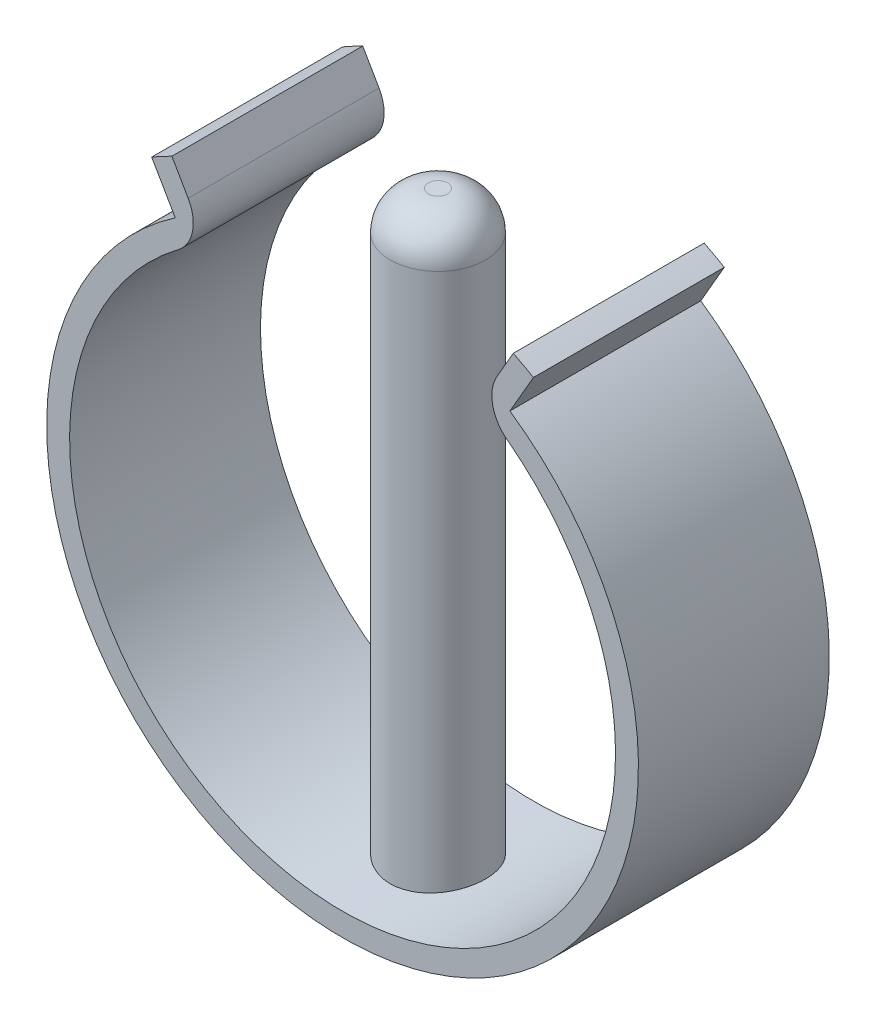
ISO-10303-21;
HEADER;
FILE_DESCRIPTION(('STEP AP214'),'2;1');
FILE_NAME('part.step','',(''),(''),'','','');
FILE_SCHEMA(('AUTOMOTIVE_DESIGN { 1 0 10303 214 1 1 1 1 }'));
ENDSEC;
DATA;
#1=APPLICATION_CONTEXT('core data for automotive mechanical design processes');
#2=APPLICATION_PROTOCOL_DEFINITION('international standard','automotive_design',2000,#1);
#3=PRODUCT_CONTEXT('',#1,'mechanical');
#4=PRODUCT('Part','Part','',(#3));
#5=PRODUCT_RELATED_PRODUCT_CATEGORY('part','',(#4));
#6=PRODUCT_DEFINITION_FORMATION('','',#4);
#7=PRODUCT_DEFINITION_CONTEXT('part definition',#1,'design');
#8=PRODUCT_DEFINITION('design','',#6,#7);
#9=PRODUCT_DEFINITION_SHAPE('','',#8);
#10=(LENGTH_UNIT() NAMED_UNIT(*) SI_UNIT(.MILLI.,.METRE.));
#11=(NAMED_UNIT(*) PLANE_ANGLE_UNIT() SI_UNIT($,.RADIAN.));
#12=(NAMED_UNIT(*) SI_UNIT($,.STERADIAN.) SOLID_ANGLE_UNIT());
#13=UNCERTAINTY_MEASURE_WITH_UNIT(LENGTH_MEASURE(1.E-05),#10,'distance_accuracy_value','');
#14=(GEOMETRIC_REPRESENTATION_CONTEXT(3) GLOBAL_UNCERTAINTY_ASSIGNED_CONTEXT((#13)) GLOBAL_UNIT_ASSIGNED_CONTEXT((#10,
#11,#12)) REPRESENTATION_CONTEXT('',''));
#15=CARTESIAN_POINT('',(0.,0.,0.));
#16=DIRECTION('',(0.,0.,1.));
#17=DIRECTION('',(1.,0.,0.));
#18=AXIS2_PLACEMENT_3D('',#15,#16,#17);
#19=CARTESIAN_POINT('',(0.,0.,-5.));
#20=DIRECTION('',(0.,0.,1.));
#21=DIRECTION('',(1.,0.,0.));
#22=AXIS2_PLACEMENT_3D('',#19,#20,#21);
#23=CYLINDRICAL_SURFACE('',#22,15.5);
#24=DIRECTION('',(0.,0.,1.));
#25=VECTOR('',#24,1.);
#26=CARTESIAN_POINT('',(8.76596977094151,12.7831050208836,-5.));
#27=LINE('',#26,#25);
#28=CARTESIAN_POINT('',(8.76596977094151,12.7831050208836,-5.));
#29=VERTEX_POINT('',#28);
#30=CARTESIAN_POINT('',(8.76596977094151,12.7831050208836,5.));
#31=VERTEX_POINT('',#30);
#32=EDGE_CURVE('E125',#29,#31,#27,.T.);
#33=ORIENTED_EDGE('',*,*,#32,.T.);
#34=CARTESIAN_POINT('',(0.,0.,5.));
#35=DIRECTION('',(0.,0.,1.));
#36=DIRECTION('',(1.,0.,0.));
#37=AXIS2_PLACEMENT_3D('',#34,#35,#36);
#38=CIRCLE('',#37,15.5);
#39=CARTESIAN_POINT('',(-8.76596977094151,12.7831050208836,5.));
#40=VERTEX_POINT('',#39);
#41=EDGE_CURVE('E123',#40,#31,#38,.T.);
#42=ORIENTED_EDGE('',*,*,#41,.F.);
#43=DIRECTION('',(0.,0.,1.));
#44=VECTOR('',#43,1.);
#45=CARTESIAN_POINT('',(-8.76596977094151,12.7831050208836,-5.));
#46=LINE('',#45,#44);
#47=CARTESIAN_POINT('',(-8.76596977094151,12.7831050208836,-5.));
#48=VERTEX_POINT('',#47);
#49=EDGE_CURVE('E176',#48,#40,#46,.T.);
#50=ORIENTED_EDGE('',*,*,#49,.F.);
#51=CARTESIAN_POINT('',(0.,0.,-5.));
#52=DIRECTION('',(0.,0.,1.));
#53=DIRECTION('',(1.,0.,0.));
#54=AXIS2_PLACEMENT_3D('',#51,#52,#53);
#55=CIRCLE('',#54,15.5);
#56=EDGE_CURVE('E130',#48,#29,#55,.T.);
#57=ORIENTED_EDGE('',*,*,#56,.T.);
#58=EDGE_LOOP('',(#33,#42,#50,#57));
#59=FACE_BOUND('',#58,.T.);
#60=ADVANCED_FACE('F44',(#59),#23,.T.);
#61=CARTESIAN_POINT('',(-8.76596977094151,12.7831050208836,-5.));
#62=DIRECTION('',(-0.866025403784439,-0.5,0.));
#63=DIRECTION('',(0.5,-0.866025403784439,0.));
#64=AXIS2_PLACEMENT_3D('',#61,#62,#63);
#65=PLANE('',#64);
#66=ORIENTED_EDGE('',*,*,#49,.T.);
#67=DIRECTION('',(0.5,-0.866025403784439,0.));
#68=VECTOR('',#67,1.);
#69=CARTESIAN_POINT('',(-8.76596977094151,12.7831050208836,5.));
#70=LINE('',#69,#68);
#71=CARTESIAN_POINT('',(-10.,14.9205080756888,5.));
#72=VERTEX_POINT('',#71);
#73=EDGE_CURVE('E150',#72,#40,#70,.T.);
#74=ORIENTED_EDGE('',*,*,#73,.F.);
#75=DIRECTION('',(0.,0.,1.));
#76=VECTOR('',#75,1.);
#77=CARTESIAN_POINT('',(-10.,14.9205080756888,-5.));
#78=LINE('',#77,#76);
#79=CARTESIAN_POINT('',(-10.,14.9205080756888,-5.));
#80=VERTEX_POINT('',#79);
#81=EDGE_CURVE('E185',#80,#72,#78,.T.);
#82=ORIENTED_EDGE('',*,*,#81,.F.);
#83=DIRECTION('',(0.5,-0.866025403784439,0.));
#84=VECTOR('',#83,1.);
#85=CARTESIAN_POINT('',(-8.76596977094151,12.7831050208836,-5.));
#86=LINE('',#85,#84);
#87=EDGE_CURVE('E131',#80,#48,#86,.T.);
#88=ORIENTED_EDGE('',*,*,#87,.T.);
#89=EDGE_LOOP('',(#66,#74,#82,#88));
#90=FACE_BOUND('',#89,.T.);
#91=ADVANCED_FACE('F214',(#90),#65,.T.);
#92=CARTESIAN_POINT('',(0.,-2.4,-5.));
#93=DIRECTION('',(0.,0.,1.));
#94=DIRECTION('',(1.,0.,0.));
#95=AXIS2_PLACEMENT_3D('',#92,#93,#94);
#96=CYLINDRICAL_SURFACE('',#95,20.);
#97=ORIENTED_EDGE('',*,*,#81,.T.);
#98=CARTESIAN_POINT('',(0.,-2.4,5.));
#99=DIRECTION('',(0.,0.,1.));
#100=DIRECTION('',(1.,0.,0.));
#101=AXIS2_PLACEMENT_3D('',#98,#99,#100);
#102=CIRCLE('',#101,20.);
#103=CARTESIAN_POINT('',(-8.94275328623292,15.4893030513089,5.));
#104=VERTEX_POINT('',#103);
#105=EDGE_CURVE('E158',#104,#72,#102,.T.);
#106=ORIENTED_EDGE('',*,*,#105,.F.);
#107=DIRECTION('',(0.,0.,1.));
#108=VECTOR('',#107,1.);
#109=CARTESIAN_POINT('',(-8.94275328623292,15.4893030513089,-5.));
#110=LINE('',#109,#108);
#111=CARTESIAN_POINT('',(-8.94275328623292,15.4893030513089,-5.));
#112=VERTEX_POINT('',#111);
#113=EDGE_CURVE('E184',#112,#104,#110,.T.);
#114=ORIENTED_EDGE('',*,*,#113,.F.);
#115=CARTESIAN_POINT('',(0.,-2.4,-5.));
#116=DIRECTION('',(0.,0.,1.));
#117=DIRECTION('',(1.,0.,0.));
#118=AXIS2_PLACEMENT_3D('',#115,#116,#117);
#119=CIRCLE('',#118,20.);
#120=EDGE_CURVE('E173',#112,#80,#119,.T.);
#121=ORIENTED_EDGE('',*,*,#120,.T.);
#122=EDGE_LOOP('',(#97,#106,#114,#121));
#123=FACE_BOUND('',#122,.T.);
#124=ADVANCED_FACE('F217',(#123),#96,.T.);
#125=CARTESIAN_POINT('',(-7.15000000000002,12.3841632741175,-5.));
#126=DIRECTION('',(0.866025403784438,0.500000000000001,0.));
#127=DIRECTION('',(-0.500000000000001,0.866025403784438,0.));
#128=AXIS2_PLACEMENT_3D('',#125,#126,#127);
#129=PLANE('',#128);
#130=DIRECTION('',(-0.500000000000001,0.866025403784438,0.));
#131=VECTOR('',#130,1.);
#132=CARTESIAN_POINT('',(-7.15000000000002,12.3841632741175,5.));
#133=LINE('',#132,#131);
#134=CARTESIAN_POINT('',(-8.08841764500328,14.0095503139822,5.));
#135=VERTEX_POINT('',#134);
#136=EDGE_CURVE('E156',#135,#104,#133,.T.);
#137=ORIENTED_EDGE('',*,*,#136,.F.);
#138=DIRECTION('',(0.,0.,1.));
#139=VECTOR('',#138,1.);
#140=CARTESIAN_POINT('',(-8.08841764500328,14.0095503139822,-5.));
#141=LINE('',#140,#139);
#142=CARTESIAN_POINT('',(-8.08841764500328,14.0095503139822,-5.));
#143=VERTEX_POINT('',#142);
#144=EDGE_CURVE('E11',#135,#143,#141,.F.);
#145=ORIENTED_EDGE('',*,*,#144,.T.);
#146=DIRECTION('',(-0.500000000000001,0.866025403784438,0.));
#147=VECTOR('',#146,1.);
#148=CARTESIAN_POINT('',(-7.15000000000002,12.3841632741175,-5.));
#149=LINE('',#148,#147);
#150=EDGE_CURVE('E171',#143,#112,#149,.T.);
#151=ORIENTED_EDGE('',*,*,#150,.T.);
#152=ORIENTED_EDGE('',*,*,#113,.T.);
#153=EDGE_LOOP('',(#137,#145,#151,#152));
#154=FACE_BOUND('',#153,.T.);
#155=ADVANCED_FACE('F222',(#154),#129,.T.);
#156=CARTESIAN_POINT('',(0.,0.,-5.));
#157=DIRECTION('',(0.,0.,1.));
#158=DIRECTION('',(1.,0.,0.));
#159=AXIS2_PLACEMENT_3D('',#156,#157,#158);
#160=CYLINDRICAL_SURFACE('',#159,14.3);
#161=CARTESIAN_POINT('',(0.,-14.3,2.5));
#162=CARTESIAN_POINT('',(0.139288277562416,-14.2999975518967,2.49999450870483));
#163=CARTESIAN_POINT('',(0.278650023034184,-14.2979437782584,2.4883199351997));
#164=CARTESIAN_POINT('',(0.553457860103778,-14.2899487036367,2.44195353779057));
#165=CARTESIAN_POINT('',(0.688900350549618,-14.2840039389414,2.4072412055744));
#166=CARTESIAN_POINT('',(0.951854614527163,-14.2688929919687,2.31588521308144));
#167=CARTESIAN_POINT('',(1.0793730254778,-14.2597295497435,2.2592602028553));
#168=CARTESIAN_POINT('',(1.32308457727279,-14.2391861745996,2.12573665759414));
#169=CARTESIAN_POINT('',(1.43927886751972,-14.2278064669849,2.04884018306201));
#170=CARTESIAN_POINT('',(1.65827565769016,-14.2039567103022,1.87610027957429));
#171=CARTESIAN_POINT('',(1.76094232757682,-14.1914774355321,1.78008590314065));
#172=CARTESIAN_POINT('',(1.94879556101695,-14.166904831696,1.57220358288925));
#173=CARTESIAN_POINT('',(2.03398096559116,-14.1548115282641,1.46033458876703));
#174=CARTESIAN_POINT('',(2.18500577752591,-14.1322906814417,1.22297525827788));
#175=CARTESIAN_POINT('',(2.2507093985838,-14.1218750507063,1.09739729582341));
#176=CARTESIAN_POINT('',(2.36003688794962,-14.1040176492056,0.83677402073406));
#177=CARTESIAN_POINT('',(2.40366240217594,-14.0965756567649,0.701729414690354));
#178=CARTESIAN_POINT('',(2.46716429655872,-14.085600397676,0.427451402259604));
#179=CARTESIAN_POINT('',(2.48727610511641,-14.0820284100191,0.288274082402589));
#180=CARTESIAN_POINT('',(2.50390994484227,-14.0790806212636,0.00847802822799592));
#181=CARTESIAN_POINT('',(2.50043381306995,-14.0797044933859,-0.132140592987476));
#182=CARTESIAN_POINT('',(2.47018188320505,-14.0850426178771,-0.409137591986059));
#183=CARTESIAN_POINT('',(2.44367177063543,-14.0897102259757,-0.545546016794229));
#184=CARTESIAN_POINT('',(2.36852190872499,-14.1025367938109,-0.811948731811814));
#185=CARTESIAN_POINT('',(2.319881331318,-14.1106958841894,-0.941942781809739));
#186=CARTESIAN_POINT('',(2.20158552478278,-14.1296358662469,-1.19261525504967));
#187=CARTESIAN_POINT('',(2.13182112488036,-14.1404303203194,-1.31324109216648));
#188=CARTESIAN_POINT('',(1.97333542198788,-14.1634155267415,-1.54117473709531));
#189=CARTESIAN_POINT('',(1.88461243943632,-14.1756064027572,-1.64848136361156));
#190=CARTESIAN_POINT('',(1.68928621772479,-14.2002151634656,-1.84826740130293));
#191=CARTESIAN_POINT('',(1.58245528565406,-14.2126338743061,-1.94052424526397));
#192=CARTESIAN_POINT('',(1.35471267020118,-14.2361454387928,-2.10583762672694));
#193=CARTESIAN_POINT('',(1.23380087840587,-14.2472382822295,-2.17889401638418));
#194=CARTESIAN_POINT('',(0.981110871820703,-14.2668664015141,-2.30375764898544));
#195=CARTESIAN_POINT('',(0.849322082562803,-14.2753991502221,-2.35554391408208));
#196=CARTESIAN_POINT('',(0.578734565215322,-14.2889257011941,-2.43618377136969));
#197=CARTESIAN_POINT('',(0.439936484418791,-14.2939198296042,-2.46503947704483));
#198=CARTESIAN_POINT('',(0.161187340423996,-14.2997622252789,-2.49869434267157));
#199=CARTESIAN_POINT('',(0.0212742045968575,-14.3006631061651,-2.50379881595949));
#200=CARTESIAN_POINT('',(-0.257407360604781,-14.2983620718502,-2.49062218479289));
#201=CARTESIAN_POINT('',(-0.396175838355369,-14.2951603309396,-2.47234207377822));
#202=CARTESIAN_POINT('',(-0.667676309785681,-14.2850464432615,-2.41316910122442));
#203=CARTESIAN_POINT('',(-0.80044253530702,-14.2781593149613,-2.37242865719155));
#204=CARTESIAN_POINT('',(-1.05726041478126,-14.2614436912942,-2.26965489974831));
#205=CARTESIAN_POINT('',(-1.18131153886808,-14.2516150172762,-2.20762029302966));
#206=CARTESIAN_POINT('',(-1.41849530947256,-14.2299756335311,-2.06332879715151));
#207=CARTESIAN_POINT('',(-1.53151119532931,-14.218146733248,-1.98088276075171));
#208=CARTESIAN_POINT('',(-1.7422128071798,-14.1938706390844,-1.79836731775207));
#209=CARTESIAN_POINT('',(-1.83989729924192,-14.1814233955431,-1.69829649401331));
#210=CARTESIAN_POINT('',(-2.01830575885352,-14.1571416827817,-1.48199777740457));
#211=CARTESIAN_POINT('',(-2.09882263596837,-14.1453158657026,-1.36559794370002));
#212=CARTESIAN_POINT('',(-2.23916032144233,-14.1237821722478,-1.12074552842336));
#213=CARTESIAN_POINT('',(-2.29898183172347,-14.1140742240446,-0.992293355816729));
#214=CARTESIAN_POINT('',(-2.39592698859753,-14.0979414974058,-0.727541398051177));
#215=CARTESIAN_POINT('',(-2.4331506206267,-14.0915022773732,-0.591279145199456));
#216=CARTESIAN_POINT('',(-2.48415580746643,-14.0826010365485,-0.314313198542639));
#217=CARTESIAN_POINT('',(-2.49793962648904,-14.0801386316097,-0.173609935062717));
#218=CARTESIAN_POINT('',(-2.50160595779181,-14.0794875027511,0.106173733379482));
#219=CARTESIAN_POINT('',(-2.49181468006623,-14.0812404503266,0.245249834402812));
#220=CARTESIAN_POINT('',(-2.44931746116375,-14.0886941112701,0.519742428900781));
#221=CARTESIAN_POINT('',(-2.41661161655367,-14.0943948080016,0.655158937795214));
#222=CARTESIAN_POINT('',(-2.32934350753039,-14.1090785598204,0.918343521998641));
#223=CARTESIAN_POINT('',(-2.2748120794775,-14.118056982394,1.04612209707664));
#224=CARTESIAN_POINT('',(-2.14547501077914,-14.138288536131,1.29076943658217));
#225=CARTESIAN_POINT('',(-2.07066820075692,-14.1495417984856,1.4076375712304));
#226=CARTESIAN_POINT('',(-1.90175097434206,-14.1732385486386,1.62878946489857));
#227=CARTESIAN_POINT('',(-1.80740151509127,-14.185695645733,1.73288921148593));
#228=CARTESIAN_POINT('',(-1.60257945822952,-14.2102905099115,1.92388939296182));
#229=CARTESIAN_POINT('',(-1.49210315388215,-14.2224282028219,2.01078586284884));
#230=CARTESIAN_POINT('',(-1.2571515023485,-14.2451252476194,2.16552830846138));
#231=CARTESIAN_POINT('',(-1.13257516811162,-14.2556717632916,2.23322286667318));
#232=CARTESIAN_POINT('',(-0.87368075825385,-14.2738732259795,2.34661743803173));
#233=CARTESIAN_POINT('',(-0.739372325392235,-14.2815309897639,2.39233888873326));
#234=CARTESIAN_POINT('',(-0.503823466570121,-14.291462259211,2.45080590023678));
#235=CARTESIAN_POINT('',(-0.403990834546766,-14.2946464368337,2.46922340465301));
#236=CARTESIAN_POINT('',(-0.202785095886067,-14.298916177338,2.49382233060553));
#237=CARTESIAN_POINT('',(-0.101412020250521,-14.3000017823977,2.5000039980632));
#238=CARTESIAN_POINT('',(0.,-14.3,2.5));
#239=B_SPLINE_CURVE_WITH_KNOTS('',3,(#161,#162,#163,#164,#165,#166,#167,#168,#169,#170,#171,
#172,#173,#174,#175,#176,#177,#178,#179,#180,#181,#182,#183,#184,#185,#186,#187,#188,#189,#190,
#191,#192,#193,#194,#195,#196,#197,#198,#199,#200,#201,#202,#203,#204,#205,#206,#207,#208,#209,
#210,#211,#212,#213,#214,#215,#216,#217,#218,#219,#220,#221,#222,#223,#224,#225,#226,#227,#228,
#229,#230,#231,#232,#233,#234,#235,#236,#237,#238),.UNSPECIFIED.,.T.,.F.,(4,2,2,2,2,2,2,2,2,2,2,
2,2,2,2,2,2,2,2,2,2,2,2,2,2,2,2,2,2,2,2,2,2,2,2,2,2,2,4),(0.,0.417494075646253,
0.835360305724249,1.25287166604409,1.67034060456971,2.09172518079196,2.51313768510256,
2.93742184769389,3.36167437532585,3.78164172264282,4.20157636273108,4.61673061720775,
5.03190040698699,5.44925357422844,5.86664373058218,6.28973554242783,6.71283061201138,
7.13634196659462,7.55981428207831,7.97782769613382,8.39582335244861,8.81101676492453,
9.22623539877767,9.64545607003911,10.0647104645661,10.4887671945157,10.9128095403789,
11.3349617496119,11.757073177955,12.1733774690907,12.589680005843,13.0053964325694,
13.4211368407232,13.8422995603916,14.2635592366871,14.6880538640175,15.1121334979569,
15.4161057299875,15.7200718525849),.UNSPECIFIED.);
#240=CARTESIAN_POINT('',(0.,-14.3,2.5));
#241=VERTEX_POINT('',#240);
#242=EDGE_CURVE('E182',#241,#241,#239,.T.);
#243=ORIENTED_EDGE('',*,*,#242,.F.);
#244=EDGE_LOOP('',(#243));
#245=FACE_BOUND('',#244,.T.);
#246=CARTESIAN_POINT('',(0.,0.,5.));
#247=DIRECTION('',(0.,0.,-1.));
#248=DIRECTION('',(1.,0.,0.));
#249=AXIS2_PLACEMENT_3D('',#246,#247,#248);
#250=CIRCLE('',#249,14.3);
#251=CARTESIAN_POINT('',(8.61550299826882,11.4132864717758,5.));
#252=VERTEX_POINT('',#251);
#253=CARTESIAN_POINT('',(-8.61550299826882,11.4132864717758,5.));
#254=VERTEX_POINT('',#253);
#255=EDGE_CURVE('E153',#252,#254,#250,.T.);
#256=ORIENTED_EDGE('',*,*,#255,.F.);
#257=DIRECTION('',(0.,0.,1.));
#258=VECTOR('',#257,1.);
#259=CARTESIAN_POINT('',(8.61550299826882,11.4132864717758,-5.));
#260=LINE('',#259,#258);
#261=CARTESIAN_POINT('',(8.61550299826882,11.4132864717758,-5.));
#262=VERTEX_POINT('',#261);
#263=EDGE_CURVE('E248',#252,#262,#260,.F.);
#264=ORIENTED_EDGE('',*,*,#263,.T.);
#265=CARTESIAN_POINT('',(0.,0.,-5.));
#266=DIRECTION('',(0.,0.,-1.));
#267=DIRECTION('',(1.,0.,0.));
#268=AXIS2_PLACEMENT_3D('',#265,#266,#267);
#269=CIRCLE('',#268,14.3);
#270=CARTESIAN_POINT('',(-8.61550299826882,11.4132864717758,-5.));
#271=VERTEX_POINT('',#270);
#272=EDGE_CURVE('E168',#262,#271,#269,.T.);
#273=ORIENTED_EDGE('',*,*,#272,.T.);
#274=DIRECTION('',(0.,0.,1.));
#275=VECTOR('',#274,1.);
#276=CARTESIAN_POINT('',(-8.61550299826882,11.4132864717758,-5.));
#277=LINE('',#276,#275);
#278=EDGE_CURVE('E260',#271,#254,#277,.T.);
#279=ORIENTED_EDGE('',*,*,#278,.T.);
#280=EDGE_LOOP('',(#256,#264,#273,#279));
#281=FACE_BOUND('',#280,.T.);
#282=ADVANCED_FACE('F200',(#245,#281),#160,.F.);
#283=CARTESIAN_POINT('',(7.15000000000002,12.3841632741175,-5.));
#284=DIRECTION('',(-0.866025403784438,0.500000000000001,0.));
#285=DIRECTION('',(-0.500000000000001,-0.866025403784438,0.));
#286=AXIS2_PLACEMENT_3D('',#283,#284,#285);
#287=PLANE('',#286);
#288=DIRECTION('',(-0.500000000000001,-0.866025403784438,0.));
#289=VECTOR('',#288,1.);
#290=CARTESIAN_POINT('',(7.15000000000002,12.3841632741175,-5.));
#291=LINE('',#290,#289);
#292=CARTESIAN_POINT('',(8.94275328623292,15.4893030513089,-5.));
#293=VERTEX_POINT('',#292);
#294=CARTESIAN_POINT('',(8.08841764500328,14.0095503139822,-5.));
#295=VERTEX_POINT('',#294);
#296=EDGE_CURVE('E170',#293,#295,#291,.T.);
#297=ORIENTED_EDGE('',*,*,#296,.T.);
#298=DIRECTION('',(0.,0.,1.));
#299=VECTOR('',#298,1.);
#300=CARTESIAN_POINT('',(8.08841764500328,14.0095503139822,-5.));
#301=LINE('',#300,#299);
#302=CARTESIAN_POINT('',(8.08841764500328,14.0095503139822,5.));
#303=VERTEX_POINT('',#302);
#304=EDGE_CURVE('E252',#295,#303,#301,.T.);
#305=ORIENTED_EDGE('',*,*,#304,.T.);
#306=DIRECTION('',(-0.500000000000001,-0.866025403784438,0.));
#307=VECTOR('',#306,1.);
#308=CARTESIAN_POINT('',(7.15000000000002,12.3841632741175,5.));
#309=LINE('',#308,#307);
#310=CARTESIAN_POINT('',(8.94275328623292,15.4893030513089,5.));
#311=VERTEX_POINT('',#310);
#312=EDGE_CURVE('E151',#311,#303,#309,.T.);
#313=ORIENTED_EDGE('',*,*,#312,.F.);
#314=DIRECTION('',(0.,0.,1.));
#315=VECTOR('',#314,1.);
#316=CARTESIAN_POINT('',(8.94275328623292,15.4893030513089,-5.));
#317=LINE('',#316,#315);
#318=EDGE_CURVE('E186',#293,#311,#317,.T.);
#319=ORIENTED_EDGE('',*,*,#318,.F.);
#320=EDGE_LOOP('',(#297,#305,#313,#319));
#321=FACE_BOUND('',#320,.T.);
#322=ADVANCED_FACE('F230',(#321),#287,.T.);
#323=CARTESIAN_POINT('',(0.,-2.4,-5.));
#324=DIRECTION('',(0.,0.,1.));
#325=DIRECTION('',(1.,0.,0.));
#326=AXIS2_PLACEMENT_3D('',#323,#324,#325);
#327=CYLINDRICAL_SURFACE('',#326,20.);
#328=ORIENTED_EDGE('',*,*,#318,.T.);
#329=CARTESIAN_POINT('',(0.,-2.4,5.));
#330=DIRECTION('',(0.,0.,1.));
#331=DIRECTION('',(1.,0.,0.));
#332=AXIS2_PLACEMENT_3D('',#329,#330,#331);
#333=CIRCLE('',#332,20.);
#334=CARTESIAN_POINT('',(10.,14.9205080756888,5.));
#335=VERTEX_POINT('',#334);
#336=EDGE_CURVE('E138',#335,#311,#333,.T.);
#337=ORIENTED_EDGE('',*,*,#336,.F.);
#338=DIRECTION('',(0.,0.,1.));
#339=VECTOR('',#338,1.);
#340=CARTESIAN_POINT('',(10.,14.9205080756888,-5.));
#341=LINE('',#340,#339);
#342=CARTESIAN_POINT('',(10.,14.9205080756888,-5.));
#343=VERTEX_POINT('',#342);
#344=EDGE_CURVE('E134',#343,#335,#341,.T.);
#345=ORIENTED_EDGE('',*,*,#344,.F.);
#346=CARTESIAN_POINT('',(0.,-2.4,-5.));
#347=DIRECTION('',(0.,0.,1.));
#348=DIRECTION('',(1.,0.,0.));
#349=AXIS2_PLACEMENT_3D('',#346,#347,#348);
#350=CIRCLE('',#349,20.);
#351=EDGE_CURVE('E163',#343,#293,#350,.T.);
#352=ORIENTED_EDGE('',*,*,#351,.T.);
#353=EDGE_LOOP('',(#328,#337,#345,#352));
#354=FACE_BOUND('',#353,.T.);
#355=ADVANCED_FACE('F304',(#354),#327,.T.);
#356=CARTESIAN_POINT('',(8.76596977094151,12.7831050208836,-5.));
#357=DIRECTION('',(0.866025403784439,-0.5,0.));
#358=DIRECTION('',(0.5,0.866025403784439,0.));
#359=AXIS2_PLACEMENT_3D('',#356,#357,#358);
#360=PLANE('',#359);
#361=ORIENTED_EDGE('',*,*,#344,.T.);
#362=DIRECTION('',(0.5,0.866025403784439,0.));
#363=VECTOR('',#362,1.);
#364=CARTESIAN_POINT('',(8.76596977094151,12.7831050208836,5.));
#365=LINE('',#364,#363);
#366=EDGE_CURVE('E132',#31,#335,#365,.T.);
#367=ORIENTED_EDGE('',*,*,#366,.F.);
#368=ORIENTED_EDGE('',*,*,#32,.F.);
#369=DIRECTION('',(0.5,0.866025403784439,0.));
#370=VECTOR('',#369,1.);
#371=CARTESIAN_POINT('',(8.76596977094151,12.7831050208836,-5.));
#372=LINE('',#371,#370);
#373=EDGE_CURVE('E165',#29,#343,#372,.T.);
#374=ORIENTED_EDGE('',*,*,#373,.T.);
#375=EDGE_LOOP('',(#361,#367,#368,#374));
#376=FACE_BOUND('',#375,.T.);
#377=ADVANCED_FACE('F137',(#376),#360,.T.);
#378=CARTESIAN_POINT('',(0.,0.,-5.));
#379=DIRECTION('',(0.,0.,1.));
#380=DIRECTION('',(1.,0.,0.));
#381=AXIS2_PLACEMENT_3D('',#378,#379,#380);
#382=PLANE('',#381);
#383=ORIENTED_EDGE('',*,*,#272,.F.);
#384=CARTESIAN_POINT('',(9.82046845257215,13.0095503139822,-5.));
#385=DIRECTION('',(0.,0.,1.));
#386=DIRECTION('',(1.,0.,0.));
#387=AXIS2_PLACEMENT_3D('',#384,#385,#386);
#388=CIRCLE('',#387,2.);
#389=EDGE_CURVE('E52',#262,#295,#388,.F.);
#390=ORIENTED_EDGE('',*,*,#389,.T.);
#391=ORIENTED_EDGE('',*,*,#296,.F.);
#392=ORIENTED_EDGE('',*,*,#351,.F.);
#393=ORIENTED_EDGE('',*,*,#373,.F.);
#394=ORIENTED_EDGE('',*,*,#56,.F.);
#395=ORIENTED_EDGE('',*,*,#87,.F.);
#396=ORIENTED_EDGE('',*,*,#120,.F.);
#397=ORIENTED_EDGE('',*,*,#150,.F.);
#398=CARTESIAN_POINT('',(-9.82046845257215,13.0095503139822,-5.));
#399=DIRECTION('',(0.,0.,1.));
#400=DIRECTION('',(1.,0.,0.));
#401=AXIS2_PLACEMENT_3D('',#398,#399,#400);
#402=CIRCLE('',#401,2.);
#403=EDGE_CURVE('E62',#143,#271,#402,.F.);
#404=ORIENTED_EDGE('',*,*,#403,.T.);
#405=EDGE_LOOP('',(#383,#390,#391,#392,#393,#394,#395,#396,#397,#404));
#406=FACE_BOUND('',#405,.T.);
#407=ADVANCED_FACE('F215',(#406),#382,.F.);
#408=CARTESIAN_POINT('',(0.,0.,5.));
#409=DIRECTION('',(0.,0.,1.));
#410=DIRECTION('',(1.,0.,0.));
#411=AXIS2_PLACEMENT_3D('',#408,#409,#410);
#412=PLANE('',#411);
#413=ORIENTED_EDGE('',*,*,#312,.T.);
#414=CARTESIAN_POINT('',(9.82046845257215,13.0095503139822,5.));
#415=DIRECTION('',(0.,0.,1.));
#416=DIRECTION('',(1.,0.,0.));
#417=AXIS2_PLACEMENT_3D('',#414,#415,#416);
#418=CIRCLE('',#417,2.);
#419=EDGE_CURVE('E257',#303,#252,#418,.T.);
#420=ORIENTED_EDGE('',*,*,#419,.T.);
#421=ORIENTED_EDGE('',*,*,#255,.T.);
#422=CARTESIAN_POINT('',(-9.82046845257215,13.0095503139822,5.));
#423=DIRECTION('',(0.,0.,1.));
#424=DIRECTION('',(1.,0.,0.));
#425=AXIS2_PLACEMENT_3D('',#422,#423,#424);
#426=CIRCLE('',#425,2.);
#427=EDGE_CURVE('E265',#254,#135,#426,.T.);
#428=ORIENTED_EDGE('',*,*,#427,.T.);
#429=ORIENTED_EDGE('',*,*,#136,.T.);
#430=ORIENTED_EDGE('',*,*,#105,.T.);
#431=ORIENTED_EDGE('',*,*,#73,.T.);
#432=ORIENTED_EDGE('',*,*,#41,.T.);
#433=ORIENTED_EDGE('',*,*,#366,.T.);
#434=ORIENTED_EDGE('',*,*,#336,.T.);
#435=EDGE_LOOP('',(#413,#420,#421,#428,#429,#430,#431,#432,#433,#434));
#436=FACE_BOUND('',#435,.T.);
#437=ADVANCED_FACE('F145',(#436),#412,.T.);
#438=CARTESIAN_POINT('',(0.,-15.502,0.));
#439=DIRECTION('',(0.,1.,0.));
#440=DIRECTION('',(0.,0.,1.));
#441=AXIS2_PLACEMENT_3D('',#438,#439,#440);
#442=CYLINDRICAL_SURFACE('',#441,2.5);
#443=CARTESIAN_POINT('',(0.,14.,0.));
#444=DIRECTION('',(0.,1.,0.));
#445=DIRECTION('',(0.,0.,1.));
#446=AXIS2_PLACEMENT_3D('',#443,#444,#445);
#447=CIRCLE('',#446,2.5);
#448=CARTESIAN_POINT('',(0.,14.,2.5));
#449=VERTEX_POINT('',#448);
#450=EDGE_CURVE('E262',#449,#449,#447,.F.);
#451=ORIENTED_EDGE('',*,*,#450,.T.);
#452=EDGE_LOOP('',(#451));
#453=FACE_BOUND('',#452,.T.);
#454=ORIENTED_EDGE('',*,*,#242,.T.);
#455=EDGE_LOOP('',(#454));
#456=FACE_BOUND('',#455,.T.);
#457=ADVANCED_FACE('F201',(#453,#456),#442,.T.);
#458=CARTESIAN_POINT('',(0.,16.,0.));
#459=DIRECTION('',(0.,1.,0.));
#460=DIRECTION('',(0.,0.,1.));
#461=AXIS2_PLACEMENT_3D('',#458,#459,#460);
#462=PLANE('',#461);
#463=CARTESIAN_POINT('',(0.,16.,0.));
#464=DIRECTION('',(0.,1.,0.));
#465=DIRECTION('',(0.,0.,1.));
#466=AXIS2_PLACEMENT_3D('',#463,#464,#465);
#467=CIRCLE('',#466,0.5);
#468=CARTESIAN_POINT('',(0.,16.,0.5));
#469=VERTEX_POINT('',#468);
#470=EDGE_CURVE('E197',#469,#469,#467,.T.);
#471=ORIENTED_EDGE('',*,*,#470,.T.);
#472=EDGE_LOOP('',(#471));
#473=FACE_BOUND('',#472,.T.);
#474=ADVANCED_FACE('F208',(#473),#462,.T.);
#475=CARTESIAN_POINT('',(0.,14.,0.));
#476=DIRECTION('',(0.,1.,0.));
#477=DIRECTION('',(0.,0.,1.));
#478=AXIS2_PLACEMENT_3D('',#475,#476,#477);
#479=DEGENERATE_TOROIDAL_SURFACE('',#478,0.5,2.,.T.);
#480=ORIENTED_EDGE('',*,*,#450,.F.);
#481=EDGE_LOOP('',(#480));
#482=FACE_BOUND('',#481,.T.);
#483=ORIENTED_EDGE('',*,*,#470,.F.);
#484=EDGE_LOOP('',(#483));
#485=FACE_BOUND('',#484,.T.);
#486=ADVANCED_FACE('F240',(#482,#485),#479,.T.);
#487=CARTESIAN_POINT('',(9.82046845257215,13.0095503139822,-5.));
#488=DIRECTION('',(0.,0.,1.));
#489=DIRECTION('',(1.,0.,0.));
#490=AXIS2_PLACEMENT_3D('',#487,#488,#489);
#491=CYLINDRICAL_SURFACE('',#490,2.);
#492=ORIENTED_EDGE('',*,*,#389,.F.);
#493=ORIENTED_EDGE('',*,*,#263,.F.);
#494=ORIENTED_EDGE('',*,*,#419,.F.);
#495=ORIENTED_EDGE('',*,*,#304,.F.);
#496=EDGE_LOOP('',(#492,#493,#494,#495));
#497=FACE_BOUND('',#496,.T.);
#498=ADVANCED_FACE('F239',(#497),#491,.T.);
#499=CARTESIAN_POINT('',(-9.82046845257215,13.0095503139822,-5.));
#500=DIRECTION('',(0.,0.,1.));
#501=DIRECTION('',(1.,0.,0.));
#502=AXIS2_PLACEMENT_3D('',#499,#500,#501);
#503=CYLINDRICAL_SURFACE('',#502,2.);
#504=ORIENTED_EDGE('',*,*,#403,.F.);
#505=ORIENTED_EDGE('',*,*,#144,.F.);
#506=ORIENTED_EDGE('',*,*,#427,.F.);
#507=ORIENTED_EDGE('',*,*,#278,.F.);
#508=EDGE_LOOP('',(#504,#505,#506,#507));
#509=FACE_BOUND('',#508,.T.);
#510=ADVANCED_FACE('F50',(#509),#503,.T.);
#511=CLOSED_SHELL('',(#60,#91,#124,#155,#282,#322,#355,#377,#407,#437,#457,#474,#486,#498,#510));
#512=MANIFOLD_SOLID_BREP('B2',#511);
#513=ADVANCED_BREP_SHAPE_REPRESENTATION('',(#18,#512),#14);
#514=SHAPE_DEFINITION_REPRESENTATION(#9,#513);
ENDSEC;
END-ISO-10303-21;
